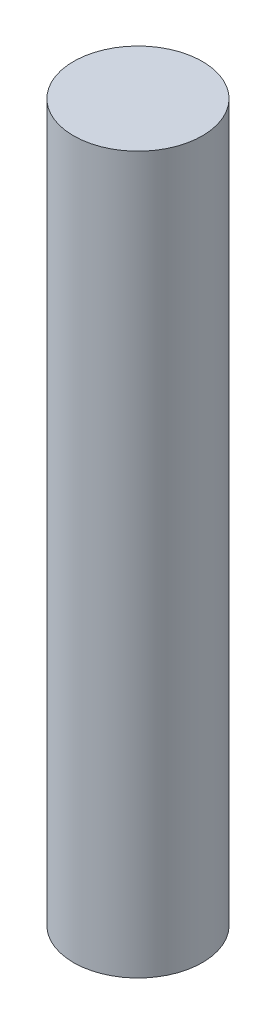
ISO-10303-21;
HEADER;
FILE_DESCRIPTION(('STEP AP214'),'2;1');
FILE_NAME('part.step','',(''),(''),'','','');
FILE_SCHEMA(('AUTOMOTIVE_DESIGN { 1 0 10303 214 1 1 1 1 }'));
ENDSEC;
DATA;
#1=APPLICATION_CONTEXT('core data for automotive mechanical design processes');
#2=APPLICATION_PROTOCOL_DEFINITION('international standard','automotive_design',2000,#1);
#3=PRODUCT_CONTEXT('',#1,'mechanical');
#4=PRODUCT('Part','Part','',(#3));
#5=PRODUCT_RELATED_PRODUCT_CATEGORY('part','',(#4));
#6=PRODUCT_DEFINITION_FORMATION('','',#4);
#7=PRODUCT_DEFINITION_CONTEXT('part definition',#1,'design');
#8=PRODUCT_DEFINITION('design','',#6,#7);
#9=PRODUCT_DEFINITION_SHAPE('','',#8);
#10=(LENGTH_UNIT() NAMED_UNIT(*) SI_UNIT(.MILLI.,.METRE.));
#11=(NAMED_UNIT(*) PLANE_ANGLE_UNIT() SI_UNIT($,.RADIAN.));
#12=(NAMED_UNIT(*) SI_UNIT($,.STERADIAN.) SOLID_ANGLE_UNIT());
#13=UNCERTAINTY_MEASURE_WITH_UNIT(LENGTH_MEASURE(1.E-05),#10,'distance_accuracy_value','');
#14=(GEOMETRIC_REPRESENTATION_CONTEXT(3) GLOBAL_UNCERTAINTY_ASSIGNED_CONTEXT((#13)) GLOBAL_UNIT_ASSIGNED_CONTEXT((#10,
#11,#12)) REPRESENTATION_CONTEXT('',''));
#15=CARTESIAN_POINT('',(0.,0.,0.));
#16=DIRECTION('',(0.,0.,1.));
#17=DIRECTION('',(1.,0.,0.));
#18=AXIS2_PLACEMENT_3D('',#15,#16,#17);
#19=CARTESIAN_POINT('',(0.,50.,0.));
#20=DIRECTION('',(0.,-1.,0.));
#21=DIRECTION('',(0.,0.,-1.));
#22=AXIS2_PLACEMENT_3D('',#19,#20,#21);
#23=CYLINDRICAL_SURFACE('',#22,4.5);
#24=CARTESIAN_POINT('',(0.,50.,0.));
#25=DIRECTION('',(0.,1.,0.));
#26=DIRECTION('',(0.,0.,1.));
#27=AXIS2_PLACEMENT_3D('',#24,#25,#26);
#28=CIRCLE('',#27,4.5);
#29=CARTESIAN_POINT('',(0.,50.,4.5));
#30=VERTEX_POINT('',#29);
#31=EDGE_CURVE('E10',#30,#30,#28,.T.);
#32=ORIENTED_EDGE('',*,*,#31,.F.);
#33=EDGE_LOOP('',(#32));
#34=FACE_BOUND('',#33,.T.);
#35=CARTESIAN_POINT('',(0.,0.,0.));
#36=DIRECTION('',(0.,1.,0.));
#37=DIRECTION('',(0.,0.,1.));
#38=AXIS2_PLACEMENT_3D('',#35,#36,#37);
#39=CIRCLE('',#38,4.5);
#40=CARTESIAN_POINT('',(0.,0.,4.5));
#41=VERTEX_POINT('',#40);
#42=EDGE_CURVE('E34',#41,#41,#39,.T.);
#43=ORIENTED_EDGE('',*,*,#42,.T.);
#44=EDGE_LOOP('',(#43));
#45=FACE_BOUND('',#44,.T.);
#46=ADVANCED_FACE('F31',(#34,#45),#23,.T.);
#47=CARTESIAN_POINT('',(0.,50.,0.));
#48=DIRECTION('',(0.,1.,0.));
#49=DIRECTION('',(0.,0.,1.));
#50=AXIS2_PLACEMENT_3D('',#47,#48,#49);
#51=PLANE('',#50);
#52=ORIENTED_EDGE('',*,*,#31,.T.);
#53=EDGE_LOOP('',(#52));
#54=FACE_BOUND('',#53,.T.);
#55=ADVANCED_FACE('F46',(#54),#51,.T.);
#56=CARTESIAN_POINT('',(0.,0.,0.));
#57=DIRECTION('',(0.,1.,0.));
#58=DIRECTION('',(0.,0.,1.));
#59=AXIS2_PLACEMENT_3D('',#56,#57,#58);
#60=PLANE('',#59);
#61=ORIENTED_EDGE('',*,*,#42,.F.);
#62=EDGE_LOOP('',(#61));
#63=FACE_BOUND('',#62,.T.);
#64=ADVANCED_FACE('F44',(#63),#60,.F.);
#65=CLOSED_SHELL('',(#46,#55,#64));
#66=MANIFOLD_SOLID_BREP('B2',#65);
#67=ADVANCED_BREP_SHAPE_REPRESENTATION('',(#18,#66),#14);
#68=SHAPE_DEFINITION_REPRESENTATION(#9,#67);
ENDSEC;
END-ISO-10303-21;
